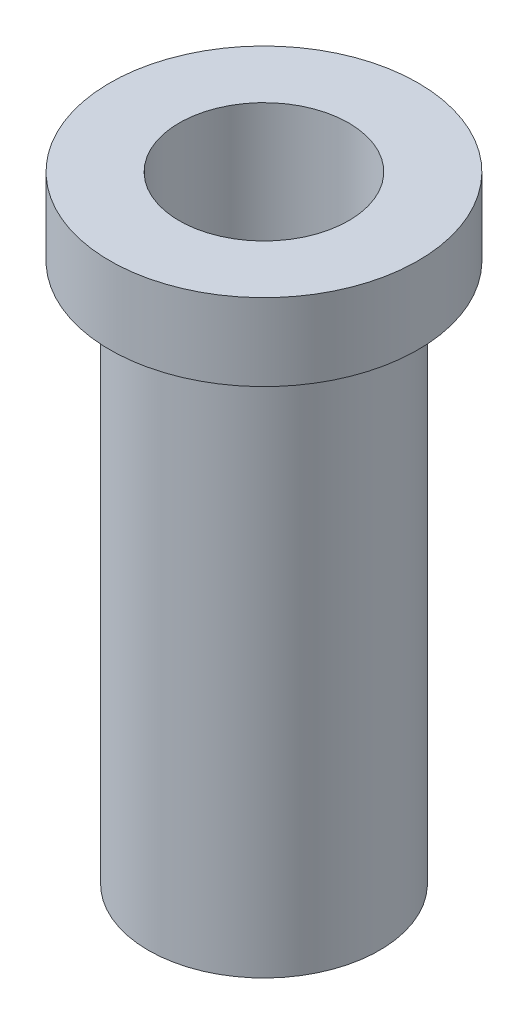
ISO-10303-21;
HEADER;
FILE_DESCRIPTION(('STEP AP214'),'2;1');
FILE_NAME('part.step','',(''),(''),'','','');
FILE_SCHEMA(('AUTOMOTIVE_DESIGN { 1 0 10303 214 1 1 1 1 }'));
ENDSEC;
DATA;
#1=APPLICATION_CONTEXT('core data for automotive mechanical design processes');
#2=APPLICATION_PROTOCOL_DEFINITION('international standard','automotive_design',2000,#1);
#3=PRODUCT_CONTEXT('',#1,'mechanical');
#4=PRODUCT('Part','Part','',(#3));
#5=PRODUCT_RELATED_PRODUCT_CATEGORY('part','',(#4));
#6=PRODUCT_DEFINITION_FORMATION('','',#4);
#7=PRODUCT_DEFINITION_CONTEXT('part definition',#1,'design');
#8=PRODUCT_DEFINITION('design','',#6,#7);
#9=PRODUCT_DEFINITION_SHAPE('','',#8);
#10=(LENGTH_UNIT() NAMED_UNIT(*) SI_UNIT(.MILLI.,.METRE.));
#11=(NAMED_UNIT(*) PLANE_ANGLE_UNIT() SI_UNIT($,.RADIAN.));
#12=(NAMED_UNIT(*) SI_UNIT($,.STERADIAN.) SOLID_ANGLE_UNIT());
#13=UNCERTAINTY_MEASURE_WITH_UNIT(LENGTH_MEASURE(1.E-05),#10,'distance_accuracy_value','');
#14=(GEOMETRIC_REPRESENTATION_CONTEXT(3) GLOBAL_UNCERTAINTY_ASSIGNED_CONTEXT((#13)) GLOBAL_UNIT_ASSIGNED_CONTEXT((#10,
#11,#12)) REPRESENTATION_CONTEXT('',''));
#15=CARTESIAN_POINT('',(0.,0.,0.));
#16=DIRECTION('',(0.,0.,1.));
#17=DIRECTION('',(1.,0.,0.));
#18=AXIS2_PLACEMENT_3D('',#15,#16,#17);
#19=CARTESIAN_POINT('',(7.5,0.,0.));
#20=DIRECTION('',(0.,-1.,0.));
#21=DIRECTION('',(0.,0.,-1.));
#22=AXIS2_PLACEMENT_3D('',#19,#20,#21);
#23=PLANE('',#22);
#24=CARTESIAN_POINT('',(0.,0.,0.));
#25=DIRECTION('',(0.,-1.,0.));
#26=DIRECTION('',(0.,0.,-1.));
#27=AXIS2_PLACEMENT_3D('',#24,#25,#26);
#28=CIRCLE('',#27,7.5);
#29=CARTESIAN_POINT('',(0.,0.,-7.5));
#30=VERTEX_POINT('',#29);
#31=EDGE_CURVE('E61',#30,#30,#28,.T.);
#32=ORIENTED_EDGE('',*,*,#31,.T.);
#33=EDGE_LOOP('',(#32));
#34=FACE_BOUND('',#33,.T.);
#35=CARTESIAN_POINT('',(0.,0.,0.));
#36=DIRECTION('',(0.,-1.,0.));
#37=DIRECTION('',(0.,0.,-1.));
#38=AXIS2_PLACEMENT_3D('',#35,#36,#37);
#39=CIRCLE('',#38,5.5);
#40=CARTESIAN_POINT('',(0.,0.,-5.5));
#41=VERTEX_POINT('',#40);
#42=EDGE_CURVE('E10',#41,#41,#39,.T.);
#43=ORIENTED_EDGE('',*,*,#42,.F.);
#44=EDGE_LOOP('',(#43));
#45=FACE_BOUND('',#44,.T.);
#46=ADVANCED_FACE('F39',(#34,#45),#23,.T.);
#47=CARTESIAN_POINT('',(0.,0.,0.));
#48=DIRECTION('',(0.,-1.,0.));
#49=DIRECTION('',(0.,0.,-1.));
#50=AXIS2_PLACEMENT_3D('',#47,#48,#49);
#51=CYLINDRICAL_SURFACE('',#50,5.5);
#52=ORIENTED_EDGE('',*,*,#42,.T.);
#53=EDGE_LOOP('',(#52));
#54=FACE_BOUND('',#53,.T.);
#55=CARTESIAN_POINT('',(0.,40.,0.));
#56=DIRECTION('',(0.,-1.,0.));
#57=DIRECTION('',(0.,0.,-1.));
#58=AXIS2_PLACEMENT_3D('',#55,#56,#57);
#59=CIRCLE('',#58,5.5);
#60=CARTESIAN_POINT('',(0.,40.,-5.5));
#61=VERTEX_POINT('',#60);
#62=EDGE_CURVE('E45',#61,#61,#59,.T.);
#63=ORIENTED_EDGE('',*,*,#62,.F.);
#64=EDGE_LOOP('',(#63));
#65=FACE_BOUND('',#64,.T.);
#66=ADVANCED_FACE('F79',(#54,#65),#51,.F.);
#67=CARTESIAN_POINT('',(5.5,40.,0.));
#68=DIRECTION('',(0.,1.,0.));
#69=DIRECTION('',(0.,0.,1.));
#70=AXIS2_PLACEMENT_3D('',#67,#68,#69);
#71=PLANE('',#70);
#72=ORIENTED_EDGE('',*,*,#62,.T.);
#73=EDGE_LOOP('',(#72));
#74=FACE_BOUND('',#73,.T.);
#75=CARTESIAN_POINT('',(0.,40.,0.));
#76=DIRECTION('',(0.,-1.,0.));
#77=DIRECTION('',(0.,0.,-1.));
#78=AXIS2_PLACEMENT_3D('',#75,#76,#77);
#79=CIRCLE('',#78,9.99999999999999);
#80=CARTESIAN_POINT('',(0.,40.,-9.99999999999999));
#81=VERTEX_POINT('',#80);
#82=EDGE_CURVE('E49',#81,#81,#79,.T.);
#83=ORIENTED_EDGE('',*,*,#82,.F.);
#84=EDGE_LOOP('',(#83));
#85=FACE_BOUND('',#84,.T.);
#86=ADVANCED_FACE('F83',(#74,#85),#71,.T.);
#87=CARTESIAN_POINT('',(0.,0.,0.));
#88=DIRECTION('',(0.,-1.,0.));
#89=DIRECTION('',(0.,0.,-1.));
#90=AXIS2_PLACEMENT_3D('',#87,#88,#89);
#91=CYLINDRICAL_SURFACE('',#90,9.99999999999999);
#92=ORIENTED_EDGE('',*,*,#82,.T.);
#93=EDGE_LOOP('',(#92));
#94=FACE_BOUND('',#93,.T.);
#95=CARTESIAN_POINT('',(0.,35.,0.));
#96=DIRECTION('',(0.,-1.,0.));
#97=DIRECTION('',(0.,0.,-1.));
#98=AXIS2_PLACEMENT_3D('',#95,#96,#97);
#99=CIRCLE('',#98,10.);
#100=CARTESIAN_POINT('',(0.,35.,-10.));
#101=VERTEX_POINT('',#100);
#102=EDGE_CURVE('E53',#101,#101,#99,.T.);
#103=ORIENTED_EDGE('',*,*,#102,.F.);
#104=EDGE_LOOP('',(#103));
#105=FACE_BOUND('',#104,.T.);
#106=ADVANCED_FACE('F75',(#94,#105),#91,.T.);
#107=CARTESIAN_POINT('',(10.,35.,0.));
#108=DIRECTION('',(0.,-1.,0.));
#109=DIRECTION('',(0.,0.,-1.));
#110=AXIS2_PLACEMENT_3D('',#107,#108,#109);
#111=PLANE('',#110);
#112=ORIENTED_EDGE('',*,*,#102,.T.);
#113=EDGE_LOOP('',(#112));
#114=FACE_BOUND('',#113,.T.);
#115=CARTESIAN_POINT('',(0.,35.,0.));
#116=DIRECTION('',(0.,-1.,0.));
#117=DIRECTION('',(0.,0.,-1.));
#118=AXIS2_PLACEMENT_3D('',#115,#116,#117);
#119=CIRCLE('',#118,7.5);
#120=CARTESIAN_POINT('',(0.,35.,-7.5));
#121=VERTEX_POINT('',#120);
#122=EDGE_CURVE('E58',#121,#121,#119,.T.);
#123=ORIENTED_EDGE('',*,*,#122,.F.);
#124=EDGE_LOOP('',(#123));
#125=FACE_BOUND('',#124,.T.);
#126=ADVANCED_FACE('F69',(#114,#125),#111,.T.);
#127=CARTESIAN_POINT('',(0.,0.,0.));
#128=DIRECTION('',(0.,-1.,0.));
#129=DIRECTION('',(0.,0.,-1.));
#130=AXIS2_PLACEMENT_3D('',#127,#128,#129);
#131=CYLINDRICAL_SURFACE('',#130,7.5);
#132=ORIENTED_EDGE('',*,*,#122,.T.);
#133=EDGE_LOOP('',(#132));
#134=FACE_BOUND('',#133,.T.);
#135=ORIENTED_EDGE('',*,*,#31,.F.);
#136=EDGE_LOOP('',(#135));
#137=FACE_BOUND('',#136,.T.);
#138=ADVANCED_FACE('F67',(#134,#137),#131,.T.);
#139=CLOSED_SHELL('',(#46,#66,#86,#106,#126,#138));
#140=MANIFOLD_SOLID_BREP('B2',#139);
#141=ADVANCED_BREP_SHAPE_REPRESENTATION('',(#18,#140),#14);
#142=SHAPE_DEFINITION_REPRESENTATION(#9,#141);
ENDSEC;
END-ISO-10303-21;
